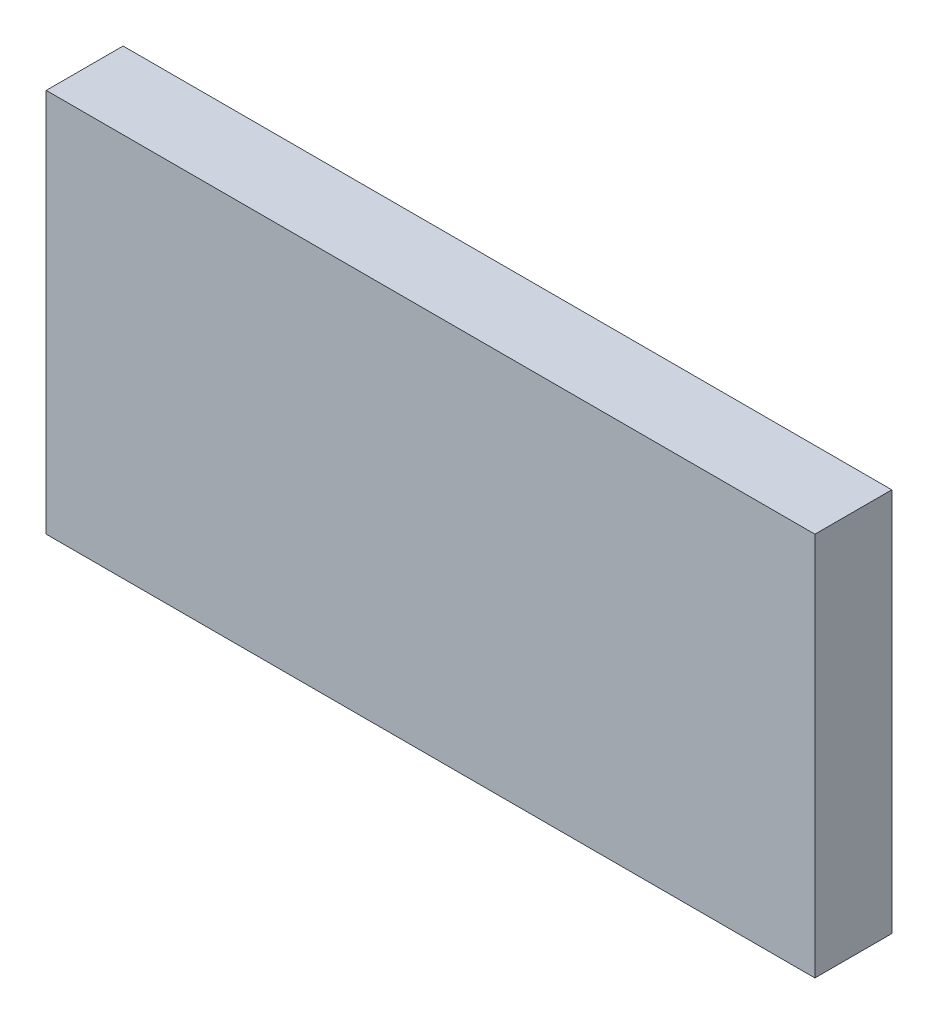
ISO-10303-21;
HEADER;
FILE_DESCRIPTION(('STEP AP214'),'2;1');
FILE_NAME('part.step','',(''),(''),'','','');
FILE_SCHEMA(('AUTOMOTIVE_DESIGN { 1 0 10303 214 1 1 1 1 }'));
ENDSEC;
DATA;
#1=APPLICATION_CONTEXT('core data for automotive mechanical design processes');
#2=APPLICATION_PROTOCOL_DEFINITION('international standard','automotive_design',2000,#1);
#3=PRODUCT_CONTEXT('',#1,'mechanical');
#4=PRODUCT('Part','Part','',(#3));
#5=PRODUCT_RELATED_PRODUCT_CATEGORY('part','',(#4));
#6=PRODUCT_DEFINITION_FORMATION('','',#4);
#7=PRODUCT_DEFINITION_CONTEXT('part definition',#1,'design');
#8=PRODUCT_DEFINITION('design','',#6,#7);
#9=PRODUCT_DEFINITION_SHAPE('','',#8);
#10=(LENGTH_UNIT() NAMED_UNIT(*) SI_UNIT(.MILLI.,.METRE.));
#11=(NAMED_UNIT(*) PLANE_ANGLE_UNIT() SI_UNIT($,.RADIAN.));
#12=(NAMED_UNIT(*) SI_UNIT($,.STERADIAN.) SOLID_ANGLE_UNIT());
#13=UNCERTAINTY_MEASURE_WITH_UNIT(LENGTH_MEASURE(1.E-05),#10,'distance_accuracy_value','');
#14=(GEOMETRIC_REPRESENTATION_CONTEXT(3) GLOBAL_UNCERTAINTY_ASSIGNED_CONTEXT((#13)) GLOBAL_UNIT_ASSIGNED_CONTEXT((#10,
#11,#12)) REPRESENTATION_CONTEXT('',''));
#15=CARTESIAN_POINT('',(0.,0.,0.));
#16=DIRECTION('',(0.,0.,1.));
#17=DIRECTION('',(1.,0.,0.));
#18=AXIS2_PLACEMENT_3D('',#15,#16,#17);
#19=CARTESIAN_POINT('',(-1.1,-0.8,0.5));
#20=DIRECTION('',(-1.,0.,0.));
#21=DIRECTION('',(0.,0.,1.));
#22=AXIS2_PLACEMENT_3D('',#19,#20,#21);
#23=PLANE('',#22);
#24=DIRECTION('',(0.,0.,-1.));
#25=VECTOR('',#24,1.);
#26=CARTESIAN_POINT('',(-1.10000000001,0.55000000001,0.50000000001));
#27=LINE('',#26,#25);
#28=CARTESIAN_POINT('',(-1.1,0.55,0.5));
#29=VERTEX_POINT('',#28);
#30=CARTESIAN_POINT('',(-1.1,0.55,0.45));
#31=VERTEX_POINT('',#30);
#32=EDGE_CURVE('E86',#29,#31,#27,.T.);
#33=ORIENTED_EDGE('',*,*,#32,.F.);
#34=DIRECTION('',(0.,1.,0.));
#35=VECTOR('',#34,1.);
#36=CARTESIAN_POINT('',(-1.10000000001,-0.40000000001,0.50000000001));
#37=LINE('',#36,#35);
#38=CARTESIAN_POINT('',(-1.1,0.8,0.5));
#39=VERTEX_POINT('',#38);
#40=EDGE_CURVE('E11',#29,#39,#37,.T.);
#41=ORIENTED_EDGE('',*,*,#40,.T.);
#42=DIRECTION('',(0.,0.,-1.));
#43=VECTOR('',#42,1.);
#44=CARTESIAN_POINT('',(-1.10000000001,0.80000000001,0.25000000001));
#45=LINE('',#44,#43);
#46=CARTESIAN_POINT('',(-1.1,0.8,0.45));
#47=VERTEX_POINT('',#46);
#48=EDGE_CURVE('E62',#39,#47,#45,.T.);
#49=ORIENTED_EDGE('',*,*,#48,.T.);
#50=DIRECTION('',(0.,1.,0.));
#51=VECTOR('',#50,1.);
#52=CARTESIAN_POINT('',(-1.10000000001,-0.80000000001,0.45000000001));
#53=LINE('',#52,#51);
#54=EDGE_CURVE('E75',#31,#47,#53,.T.);
#55=ORIENTED_EDGE('',*,*,#54,.F.);
#56=EDGE_LOOP('',(#33,#41,#49,#55));
#57=FACE_BOUND('',#56,.T.);
#58=ADVANCED_FACE('F17',(#57),#23,.T.);
#59=CARTESIAN_POINT('',(0.,0.,0.5));
#60=DIRECTION('',(0.,0.,1.));
#61=DIRECTION('',(1.,0.,0.));
#62=AXIS2_PLACEMENT_3D('',#59,#60,#61);
#63=PLANE('',#62);
#64=DIRECTION('',(-1.,0.,0.));
#65=VECTOR('',#64,1.);
#66=CARTESIAN_POINT('',(-0.30000000001,0.55000000001,0.50000000001));
#67=LINE('',#66,#65);
#68=CARTESIAN_POINT('',(-0.6,0.55,0.5));
#69=VERTEX_POINT('',#68);
#70=EDGE_CURVE('E70',#69,#29,#67,.T.);
#71=ORIENTED_EDGE('',*,*,#70,.F.);
#72=DIRECTION('',(0.,-1.,0.));
#73=VECTOR('',#72,1.);
#74=CARTESIAN_POINT('',(-0.60000000001,0.40000000001,0.50000000001));
#75=LINE('',#74,#73);
#76=CARTESIAN_POINT('',(-0.6,0.8,0.5));
#77=VERTEX_POINT('',#76);
#78=EDGE_CURVE('E68',#77,#69,#75,.T.);
#79=ORIENTED_EDGE('',*,*,#78,.F.);
#80=DIRECTION('',(-1.,0.,0.));
#81=VECTOR('',#80,1.);
#82=CARTESIAN_POINT('',(1.60000000001,0.80000000001,0.50000000001));
#83=LINE('',#82,#81);
#84=EDGE_CURVE('E27',#77,#39,#83,.T.);
#85=ORIENTED_EDGE('',*,*,#84,.T.);
#86=ORIENTED_EDGE('',*,*,#40,.F.);
#87=EDGE_LOOP('',(#71,#79,#85,#86));
#88=FACE_BOUND('',#87,.T.);
#89=ADVANCED_FACE('F19',(#88),#63,.T.);
#90=CARTESIAN_POINT('',(1.6,0.8,0.));
#91=DIRECTION('',(0.,1.,0.));
#92=DIRECTION('',(1.,0.,0.));
#93=AXIS2_PLACEMENT_3D('',#90,#91,#92);
#94=PLANE('',#93);
#95=DIRECTION('',(1.,0.,0.));
#96=VECTOR('',#95,1.);
#97=CARTESIAN_POINT('',(0.37500000001,0.80000000001,0.45000000001));
#98=LINE('',#97,#96);
#99=CARTESIAN_POINT('',(-0.6,0.8,0.45));
#100=VERTEX_POINT('',#99);
#101=EDGE_CURVE('E101',#47,#100,#98,.T.);
#102=ORIENTED_EDGE('',*,*,#101,.F.);
#103=ORIENTED_EDGE('',*,*,#48,.F.);
#104=ORIENTED_EDGE('',*,*,#84,.F.);
#105=DIRECTION('',(0.,0.,1.));
#106=VECTOR('',#105,1.);
#107=CARTESIAN_POINT('',(-0.60000000001,0.80000000001,0.25000000001));
#108=LINE('',#107,#106);
#109=EDGE_CURVE('E60',#100,#77,#108,.T.);
#110=ORIENTED_EDGE('',*,*,#109,.F.);
#111=EDGE_LOOP('',(#102,#103,#104,#110));
#112=FACE_BOUND('',#111,.T.);
#113=ADVANCED_FACE('F58',(#112),#94,.T.);
#114=CARTESIAN_POINT('',(-0.85,0.,0.45));
#115=DIRECTION('',(0.,0.,1.));
#116=DIRECTION('',(1.,0.,0.));
#117=AXIS2_PLACEMENT_3D('',#114,#115,#116);
#118=PLANE('',#117);
#119=ORIENTED_EDGE('',*,*,#54,.T.);
#120=ORIENTED_EDGE('',*,*,#101,.T.);
#121=DIRECTION('',(0.,-1.,0.));
#122=VECTOR('',#121,1.);
#123=CARTESIAN_POINT('',(-0.60000000001,0.40000000001,0.45000000001));
#124=LINE('',#123,#122);
#125=CARTESIAN_POINT('',(-0.6,0.55,0.45));
#126=VERTEX_POINT('',#125);
#127=EDGE_CURVE('E79',#100,#126,#124,.T.);
#128=ORIENTED_EDGE('',*,*,#127,.T.);
#129=DIRECTION('',(-1.,0.,0.));
#130=VECTOR('',#129,1.);
#131=CARTESIAN_POINT('',(-0.72500000001,0.55000000001,0.45000000001));
#132=LINE('',#131,#130);
#133=EDGE_CURVE('E90',#126,#31,#132,.T.);
#134=ORIENTED_EDGE('',*,*,#133,.T.);
#135=EDGE_LOOP('',(#119,#120,#128,#134));
#136=FACE_BOUND('',#135,.T.);
#137=ADVANCED_FACE('F108',(#136),#118,.F.);
#138=CARTESIAN_POINT('',(-0.6,0.8,0.5));
#139=DIRECTION('',(1.,0.,0.));
#140=DIRECTION('',(0.,1.,0.));
#141=AXIS2_PLACEMENT_3D('',#138,#139,#140);
#142=PLANE('',#141);
#143=ORIENTED_EDGE('',*,*,#127,.F.);
#144=ORIENTED_EDGE('',*,*,#109,.T.);
#145=ORIENTED_EDGE('',*,*,#78,.T.);
#146=DIRECTION('',(0.,0.,-1.));
#147=VECTOR('',#146,1.);
#148=CARTESIAN_POINT('',(-0.60000000001,0.55000000001,0.50000000001));
#149=LINE('',#148,#147);
#150=EDGE_CURVE('E93',#69,#126,#149,.T.);
#151=ORIENTED_EDGE('',*,*,#150,.T.);
#152=EDGE_LOOP('',(#143,#144,#145,#151));
#153=FACE_BOUND('',#152,.T.);
#154=ADVANCED_FACE('F77',(#153),#142,.T.);
#155=CARTESIAN_POINT('',(-0.6,0.55,0.5));
#156=DIRECTION('',(0.,-1.,0.));
#157=DIRECTION('',(0.,0.,-1.));
#158=AXIS2_PLACEMENT_3D('',#155,#156,#157);
#159=PLANE('',#158);
#160=ORIENTED_EDGE('',*,*,#133,.F.);
#161=ORIENTED_EDGE('',*,*,#150,.F.);
#162=ORIENTED_EDGE('',*,*,#70,.T.);
#163=ORIENTED_EDGE('',*,*,#32,.T.);
#164=EDGE_LOOP('',(#160,#161,#162,#163));
#165=FACE_BOUND('',#164,.T.);
#166=ADVANCED_FACE('F114',(#165),#159,.T.);
#167=CLOSED_SHELL('',(#58,#89,#113,#137,#154,#166));
#168=MANIFOLD_SOLID_BREP('B1',#167);
#169=ADVANCED_BREP_SHAPE_REPRESENTATION('',(#18,#168),#14);
#170=SHAPE_DEFINITION_REPRESENTATION(#9,#169);
ENDSEC;
END-ISO-10303-21;
